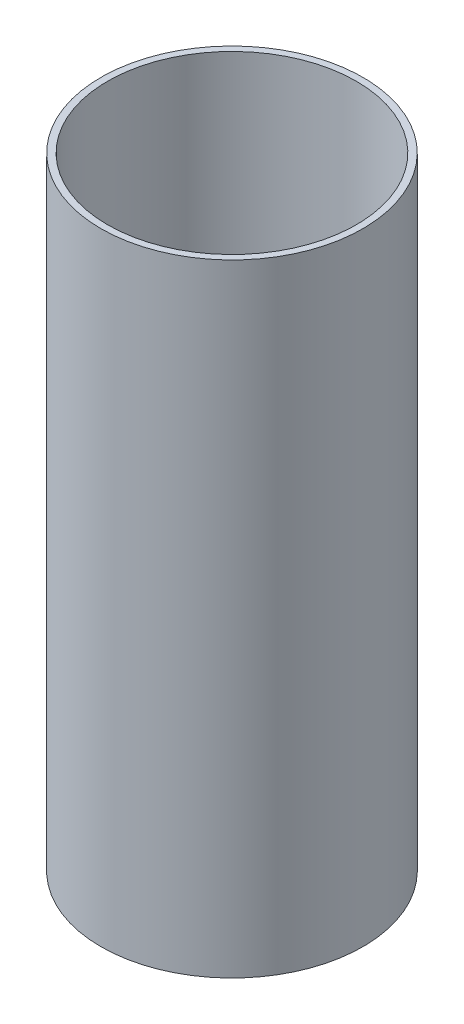
ISO-10303-21;
HEADER;
FILE_DESCRIPTION(('STEP AP214'),'2;1');
FILE_NAME('part.step','',(''),(''),'','','');
FILE_SCHEMA(('AUTOMOTIVE_DESIGN { 1 0 10303 214 1 1 1 1 }'));
ENDSEC;
DATA;
#1=APPLICATION_CONTEXT('core data for automotive mechanical design processes');
#2=APPLICATION_PROTOCOL_DEFINITION('international standard','automotive_design',2000,#1);
#3=PRODUCT_CONTEXT('',#1,'mechanical');
#4=PRODUCT('Part','Part','',(#3));
#5=PRODUCT_RELATED_PRODUCT_CATEGORY('part','',(#4));
#6=PRODUCT_DEFINITION_FORMATION('','',#4);
#7=PRODUCT_DEFINITION_CONTEXT('part definition',#1,'design');
#8=PRODUCT_DEFINITION('design','',#6,#7);
#9=PRODUCT_DEFINITION_SHAPE('','',#8);
#10=(LENGTH_UNIT() NAMED_UNIT(*) SI_UNIT(.MILLI.,.METRE.));
#11=(NAMED_UNIT(*) PLANE_ANGLE_UNIT() SI_UNIT($,.RADIAN.));
#12=(NAMED_UNIT(*) SI_UNIT($,.STERADIAN.) SOLID_ANGLE_UNIT());
#13=UNCERTAINTY_MEASURE_WITH_UNIT(LENGTH_MEASURE(1.E-05),#10,'distance_accuracy_value','');
#14=(GEOMETRIC_REPRESENTATION_CONTEXT(3) GLOBAL_UNCERTAINTY_ASSIGNED_CONTEXT((#13)) GLOBAL_UNIT_ASSIGNED_CONTEXT((#10,
#11,#12)) REPRESENTATION_CONTEXT('',''));
#15=CARTESIAN_POINT('',(0.,0.,0.));
#16=DIRECTION('',(0.,0.,1.));
#17=DIRECTION('',(1.,0.,0.));
#18=AXIS2_PLACEMENT_3D('',#15,#16,#17);
#19=CARTESIAN_POINT('',(0.,222.25,0.));
#20=DIRECTION('',(0.,1.,0.));
#21=DIRECTION('',(0.,0.,1.));
#22=AXIS2_PLACEMENT_3D('',#19,#20,#21);
#23=PLANE('',#22);
#24=CARTESIAN_POINT('',(0.,222.25,0.));
#25=DIRECTION('',(0.,1.,0.));
#26=DIRECTION('',(0.,0.,1.));
#27=AXIS2_PLACEMENT_3D('',#24,#25,#26);
#28=CIRCLE('',#27,93.6625);
#29=CARTESIAN_POINT('',(0.,222.25,93.6625));
#30=VERTEX_POINT('',#29);
#31=EDGE_CURVE('E10',#30,#30,#28,.T.);
#32=ORIENTED_EDGE('',*,*,#31,.T.);
#33=EDGE_LOOP('',(#32));
#34=FACE_BOUND('',#33,.T.);
#35=CARTESIAN_POINT('',(0.,222.25,0.));
#36=DIRECTION('',(0.,1.,0.));
#37=DIRECTION('',(0.,0.,1.));
#38=AXIS2_PLACEMENT_3D('',#35,#36,#37);
#39=CIRCLE('',#38,88.9);
#40=CARTESIAN_POINT('',(0.,222.25,88.9));
#41=VERTEX_POINT('',#40);
#42=EDGE_CURVE('E52',#41,#41,#39,.T.);
#43=ORIENTED_EDGE('',*,*,#42,.F.);
#44=EDGE_LOOP('',(#43));
#45=FACE_BOUND('',#44,.T.);
#46=ADVANCED_FACE('F41',(#34,#45),#23,.T.);
#47=CARTESIAN_POINT('',(0.,-222.25,0.));
#48=DIRECTION('',(0.,1.,0.));
#49=DIRECTION('',(0.,0.,1.));
#50=AXIS2_PLACEMENT_3D('',#47,#48,#49);
#51=PLANE('',#50);
#52=CARTESIAN_POINT('',(0.,-222.25,0.));
#53=DIRECTION('',(0.,1.,0.));
#54=DIRECTION('',(0.,0.,1.));
#55=AXIS2_PLACEMENT_3D('',#52,#53,#54);
#56=CIRCLE('',#55,93.6625);
#57=CARTESIAN_POINT('',(0.,-222.25,93.6625));
#58=VERTEX_POINT('',#57);
#59=EDGE_CURVE('E45',#58,#58,#56,.T.);
#60=ORIENTED_EDGE('',*,*,#59,.F.);
#61=EDGE_LOOP('',(#60));
#62=FACE_BOUND('',#61,.T.);
#63=CARTESIAN_POINT('',(0.,-222.25,0.));
#64=DIRECTION('',(0.,1.,0.));
#65=DIRECTION('',(0.,0.,1.));
#66=AXIS2_PLACEMENT_3D('',#63,#64,#65);
#67=CIRCLE('',#66,88.9);
#68=CARTESIAN_POINT('',(0.,-222.25,88.9));
#69=VERTEX_POINT('',#68);
#70=EDGE_CURVE('E54',#69,#69,#67,.T.);
#71=ORIENTED_EDGE('',*,*,#70,.T.);
#72=EDGE_LOOP('',(#71));
#73=FACE_BOUND('',#72,.T.);
#74=ADVANCED_FACE('F64',(#62,#73),#51,.F.);
#75=CARTESIAN_POINT('',(0.,222.25,0.));
#76=DIRECTION('',(0.,-1.,0.));
#77=DIRECTION('',(0.,0.,-1.));
#78=AXIS2_PLACEMENT_3D('',#75,#76,#77);
#79=CYLINDRICAL_SURFACE('',#78,93.6625);
#80=ORIENTED_EDGE('',*,*,#31,.F.);
#81=EDGE_LOOP('',(#80));
#82=FACE_BOUND('',#81,.T.);
#83=ORIENTED_EDGE('',*,*,#59,.T.);
#84=EDGE_LOOP('',(#83));
#85=FACE_BOUND('',#84,.T.);
#86=ADVANCED_FACE('F43',(#82,#85),#79,.T.);
#87=CARTESIAN_POINT('',(0.,222.25,0.));
#88=DIRECTION('',(0.,-1.,0.));
#89=DIRECTION('',(0.,0.,-1.));
#90=AXIS2_PLACEMENT_3D('',#87,#88,#89);
#91=CYLINDRICAL_SURFACE('',#90,88.9);
#92=ORIENTED_EDGE('',*,*,#42,.T.);
#93=EDGE_LOOP('',(#92));
#94=FACE_BOUND('',#93,.T.);
#95=ORIENTED_EDGE('',*,*,#70,.F.);
#96=EDGE_LOOP('',(#95));
#97=FACE_BOUND('',#96,.T.);
#98=ADVANCED_FACE('F60',(#94,#97),#91,.F.);
#99=CLOSED_SHELL('',(#46,#74,#86,#98));
#100=MANIFOLD_SOLID_BREP('B2',#99);
#101=ADVANCED_BREP_SHAPE_REPRESENTATION('',(#18,#100),#14);
#102=SHAPE_DEFINITION_REPRESENTATION(#9,#101);
ENDSEC;
END-ISO-10303-21;
